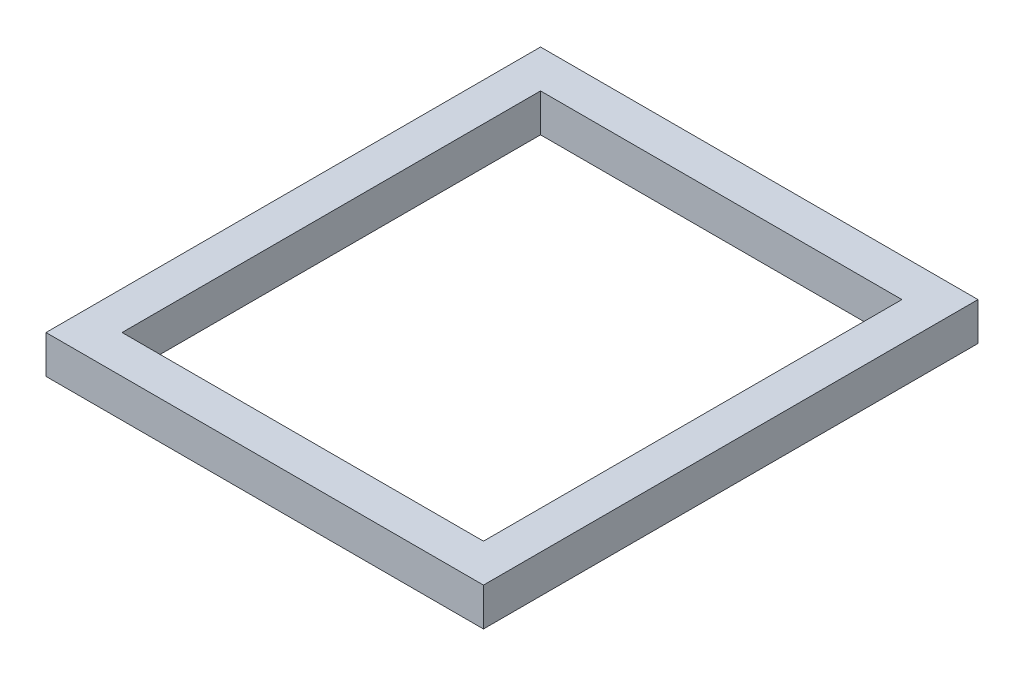
ISO-10303-21;
HEADER;
FILE_DESCRIPTION(('STEP AP214'),'2;1');
FILE_NAME('part.step','',(''),(''),'','','');
FILE_SCHEMA(('AUTOMOTIVE_DESIGN { 1 0 10303 214 1 1 1 1 }'));
ENDSEC;
DATA;
#1=APPLICATION_CONTEXT('core data for automotive mechanical design processes');
#2=APPLICATION_PROTOCOL_DEFINITION('international standard','automotive_design',2000,#1);
#3=PRODUCT_CONTEXT('',#1,'mechanical');
#4=PRODUCT('Part','Part','',(#3));
#5=PRODUCT_RELATED_PRODUCT_CATEGORY('part','',(#4));
#6=PRODUCT_DEFINITION_FORMATION('','',#4);
#7=PRODUCT_DEFINITION_CONTEXT('part definition',#1,'design');
#8=PRODUCT_DEFINITION('design','',#6,#7);
#9=PRODUCT_DEFINITION_SHAPE('','',#8);
#10=(LENGTH_UNIT() NAMED_UNIT(*) SI_UNIT(.MILLI.,.METRE.));
#11=(NAMED_UNIT(*) PLANE_ANGLE_UNIT() SI_UNIT($,.RADIAN.));
#12=(NAMED_UNIT(*) SI_UNIT($,.STERADIAN.) SOLID_ANGLE_UNIT());
#13=UNCERTAINTY_MEASURE_WITH_UNIT(LENGTH_MEASURE(1.E-05),#10,'distance_accuracy_value','');
#14=(GEOMETRIC_REPRESENTATION_CONTEXT(3) GLOBAL_UNCERTAINTY_ASSIGNED_CONTEXT((#13)) GLOBAL_UNIT_ASSIGNED_CONTEXT((#10,
#11,#12)) REPRESENTATION_CONTEXT('',''));
#15=CARTESIAN_POINT('',(0.,0.,0.));
#16=DIRECTION('',(0.,0.,1.));
#17=DIRECTION('',(1.,0.,0.));
#18=AXIS2_PLACEMENT_3D('',#15,#16,#17);
#19=CARTESIAN_POINT('',(0.,6.35,0.));
#20=DIRECTION('',(0.,-1.,0.));
#21=DIRECTION('',(0.,0.,-1.));
#22=AXIS2_PLACEMENT_3D('',#19,#20,#21);
#23=PLANE('',#22);
#24=DIRECTION('',(0.,0.,-1.));
#25=VECTOR('',#24,1.);
#26=CARTESIAN_POINT('',(36.5125,6.35,41.275));
#27=LINE('',#26,#25);
#28=CARTESIAN_POINT('',(36.5125,6.35,41.275));
#29=VERTEX_POINT('',#28);
#30=CARTESIAN_POINT('',(36.5125,6.35,-41.275));
#31=VERTEX_POINT('',#30);
#32=EDGE_CURVE('E134',#29,#31,#27,.T.);
#33=ORIENTED_EDGE('',*,*,#32,.T.);
#34=DIRECTION('',(-1.,0.,0.));
#35=VECTOR('',#34,1.);
#36=CARTESIAN_POINT('',(-36.5125,6.35,-41.275));
#37=LINE('',#36,#35);
#38=CARTESIAN_POINT('',(-36.5125,6.35,-41.275));
#39=VERTEX_POINT('',#38);
#40=EDGE_CURVE('E137',#31,#39,#37,.T.);
#41=ORIENTED_EDGE('',*,*,#40,.T.);
#42=DIRECTION('',(0.,0.,1.));
#43=VECTOR('',#42,1.);
#44=CARTESIAN_POINT('',(-36.5125,6.35,41.275));
#45=LINE('',#44,#43);
#46=CARTESIAN_POINT('',(-36.5125,6.35,41.275));
#47=VERTEX_POINT('',#46);
#48=EDGE_CURVE('E140',#39,#47,#45,.T.);
#49=ORIENTED_EDGE('',*,*,#48,.T.);
#50=DIRECTION('',(1.,0.,0.));
#51=VECTOR('',#50,1.);
#52=CARTESIAN_POINT('',(-36.5125,6.35,41.275));
#53=LINE('',#52,#51);
#54=EDGE_CURVE('E142',#47,#29,#53,.T.);
#55=ORIENTED_EDGE('',*,*,#54,.T.);
#56=EDGE_LOOP('',(#33,#41,#49,#55));
#57=FACE_BOUND('',#56,.T.);
#58=DIRECTION('',(0.,0.,-1.));
#59=VECTOR('',#58,1.);
#60=CARTESIAN_POINT('',(30.1625,6.35,34.925));
#61=LINE('',#60,#59);
#62=CARTESIAN_POINT('',(30.1625,6.35,34.925));
#63=VERTEX_POINT('',#62);
#64=CARTESIAN_POINT('',(30.1625,6.35,-34.925));
#65=VERTEX_POINT('',#64);
#66=EDGE_CURVE('E98',#63,#65,#61,.T.);
#67=ORIENTED_EDGE('',*,*,#66,.F.);
#68=DIRECTION('',(1.,0.,0.));
#69=VECTOR('',#68,1.);
#70=CARTESIAN_POINT('',(-30.1625,6.35,34.925));
#71=LINE('',#70,#69);
#72=CARTESIAN_POINT('',(-30.1625,6.35,34.925));
#73=VERTEX_POINT('',#72);
#74=EDGE_CURVE('E120',#73,#63,#71,.T.);
#75=ORIENTED_EDGE('',*,*,#74,.F.);
#76=DIRECTION('',(0.,0.,1.));
#77=VECTOR('',#76,1.);
#78=CARTESIAN_POINT('',(-30.1625,6.35,34.925));
#79=LINE('',#78,#77);
#80=CARTESIAN_POINT('',(-30.1625,6.35,-34.925));
#81=VERTEX_POINT('',#80);
#82=EDGE_CURVE('E118',#81,#73,#79,.T.);
#83=ORIENTED_EDGE('',*,*,#82,.F.);
#84=DIRECTION('',(-1.,0.,0.));
#85=VECTOR('',#84,1.);
#86=CARTESIAN_POINT('',(-30.1625,6.35,-34.925));
#87=LINE('',#86,#85);
#88=EDGE_CURVE('E106',#65,#81,#87,.T.);
#89=ORIENTED_EDGE('',*,*,#88,.F.);
#90=EDGE_LOOP('',(#67,#75,#83,#89));
#91=FACE_BOUND('',#90,.T.);
#92=ADVANCED_FACE('F33',(#57,#91),#23,.F.);
#93=CARTESIAN_POINT('',(0.,0.,0.));
#94=DIRECTION('',(0.,-1.,0.));
#95=DIRECTION('',(0.,0.,-1.));
#96=AXIS2_PLACEMENT_3D('',#93,#94,#95);
#97=PLANE('',#96);
#98=DIRECTION('',(0.,0.,-1.));
#99=VECTOR('',#98,1.);
#100=CARTESIAN_POINT('',(36.5125,0.,41.275));
#101=LINE('',#100,#99);
#102=CARTESIAN_POINT('',(36.5125,0.,41.275));
#103=VERTEX_POINT('',#102);
#104=CARTESIAN_POINT('',(36.5125,0.,-41.275));
#105=VERTEX_POINT('',#104);
#106=EDGE_CURVE('E114',#103,#105,#101,.T.);
#107=ORIENTED_EDGE('',*,*,#106,.F.);
#108=DIRECTION('',(1.,0.,0.));
#109=VECTOR('',#108,1.);
#110=CARTESIAN_POINT('',(-36.5125,0.,41.275));
#111=LINE('',#110,#109);
#112=CARTESIAN_POINT('',(-36.5125,0.,41.275));
#113=VERTEX_POINT('',#112);
#114=EDGE_CURVE('E138',#113,#103,#111,.T.);
#115=ORIENTED_EDGE('',*,*,#114,.F.);
#116=DIRECTION('',(0.,0.,1.));
#117=VECTOR('',#116,1.);
#118=CARTESIAN_POINT('',(-36.5125,0.,41.275));
#119=LINE('',#118,#117);
#120=CARTESIAN_POINT('',(-36.5125,0.,-41.275));
#121=VERTEX_POINT('',#120);
#122=EDGE_CURVE('E149',#121,#113,#119,.T.);
#123=ORIENTED_EDGE('',*,*,#122,.F.);
#124=DIRECTION('',(-1.,0.,0.));
#125=VECTOR('',#124,1.);
#126=CARTESIAN_POINT('',(-36.5125,0.,-41.275));
#127=LINE('',#126,#125);
#128=EDGE_CURVE('E147',#105,#121,#127,.T.);
#129=ORIENTED_EDGE('',*,*,#128,.F.);
#130=EDGE_LOOP('',(#107,#115,#123,#129));
#131=FACE_BOUND('',#130,.T.);
#132=DIRECTION('',(1.,0.,0.));
#133=VECTOR('',#132,1.);
#134=CARTESIAN_POINT('',(-30.1625,0.,34.925));
#135=LINE('',#134,#133);
#136=CARTESIAN_POINT('',(-30.1625,0.,34.925));
#137=VERTEX_POINT('',#136);
#138=CARTESIAN_POINT('',(30.1625,0.,34.925));
#139=VERTEX_POINT('',#138);
#140=EDGE_CURVE('E107',#137,#139,#135,.T.);
#141=ORIENTED_EDGE('',*,*,#140,.T.);
#142=DIRECTION('',(0.,0.,-1.));
#143=VECTOR('',#142,1.);
#144=CARTESIAN_POINT('',(30.1625,0.,34.925));
#145=LINE('',#144,#143);
#146=CARTESIAN_POINT('',(30.1625,0.,-34.925));
#147=VERTEX_POINT('',#146);
#148=EDGE_CURVE('E56',#139,#147,#145,.T.);
#149=ORIENTED_EDGE('',*,*,#148,.T.);
#150=DIRECTION('',(-1.,0.,0.));
#151=VECTOR('',#150,1.);
#152=CARTESIAN_POINT('',(-30.1625,0.,-34.925));
#153=LINE('',#152,#151);
#154=CARTESIAN_POINT('',(-30.1625,0.,-34.925));
#155=VERTEX_POINT('',#154);
#156=EDGE_CURVE('E113',#147,#155,#153,.T.);
#157=ORIENTED_EDGE('',*,*,#156,.T.);
#158=DIRECTION('',(0.,0.,1.));
#159=VECTOR('',#158,1.);
#160=CARTESIAN_POINT('',(-30.1625,0.,34.925));
#161=LINE('',#160,#159);
#162=EDGE_CURVE('E126',#155,#137,#161,.T.);
#163=ORIENTED_EDGE('',*,*,#162,.T.);
#164=EDGE_LOOP('',(#141,#149,#157,#163));
#165=FACE_BOUND('',#164,.T.);
#166=ADVANCED_FACE('F167',(#131,#165),#97,.T.);
#167=CARTESIAN_POINT('',(36.5125,6.35,41.275));
#168=DIRECTION('',(-1.,0.,0.));
#169=DIRECTION('',(0.,0.,1.));
#170=AXIS2_PLACEMENT_3D('',#167,#168,#169);
#171=PLANE('',#170);
#172=ORIENTED_EDGE('',*,*,#106,.T.);
#173=DIRECTION('',(0.,-1.,0.));
#174=VECTOR('',#173,1.);
#175=CARTESIAN_POINT('',(36.5125,6.35,-41.275));
#176=LINE('',#175,#174);
#177=EDGE_CURVE('E11',#31,#105,#176,.T.);
#178=ORIENTED_EDGE('',*,*,#177,.F.);
#179=ORIENTED_EDGE('',*,*,#32,.F.);
#180=DIRECTION('',(0.,-1.,0.));
#181=VECTOR('',#180,1.);
#182=CARTESIAN_POINT('',(36.5125,6.35,41.275));
#183=LINE('',#182,#181);
#184=EDGE_CURVE('E144',#29,#103,#183,.T.);
#185=ORIENTED_EDGE('',*,*,#184,.T.);
#186=EDGE_LOOP('',(#172,#178,#179,#185));
#187=FACE_BOUND('',#186,.T.);
#188=ADVANCED_FACE('F35',(#187),#171,.F.);
#189=CARTESIAN_POINT('',(-36.5125,6.35,-41.275));
#190=DIRECTION('',(0.,0.,1.));
#191=DIRECTION('',(1.,0.,0.));
#192=AXIS2_PLACEMENT_3D('',#189,#190,#191);
#193=PLANE('',#192);
#194=ORIENTED_EDGE('',*,*,#128,.T.);
#195=DIRECTION('',(0.,-1.,0.));
#196=VECTOR('',#195,1.);
#197=CARTESIAN_POINT('',(-36.5125,6.35,-41.275));
#198=LINE('',#197,#196);
#199=EDGE_CURVE('E41',#39,#121,#198,.T.);
#200=ORIENTED_EDGE('',*,*,#199,.F.);
#201=ORIENTED_EDGE('',*,*,#40,.F.);
#202=ORIENTED_EDGE('',*,*,#177,.T.);
#203=EDGE_LOOP('',(#194,#200,#201,#202));
#204=FACE_BOUND('',#203,.T.);
#205=ADVANCED_FACE('F177',(#204),#193,.F.);
#206=CARTESIAN_POINT('',(-36.5125,6.35,41.275));
#207=DIRECTION('',(1.,0.,0.));
#208=DIRECTION('',(0.,0.,-1.));
#209=AXIS2_PLACEMENT_3D('',#206,#207,#208);
#210=PLANE('',#209);
#211=ORIENTED_EDGE('',*,*,#122,.T.);
#212=DIRECTION('',(0.,-1.,0.));
#213=VECTOR('',#212,1.);
#214=CARTESIAN_POINT('',(-36.5125,6.35,41.275));
#215=LINE('',#214,#213);
#216=EDGE_CURVE('E154',#47,#113,#215,.T.);
#217=ORIENTED_EDGE('',*,*,#216,.F.);
#218=ORIENTED_EDGE('',*,*,#48,.F.);
#219=ORIENTED_EDGE('',*,*,#199,.T.);
#220=EDGE_LOOP('',(#211,#217,#218,#219));
#221=FACE_BOUND('',#220,.T.);
#222=ADVANCED_FACE('F161',(#221),#210,.F.);
#223=CARTESIAN_POINT('',(-36.5125,6.35,41.275));
#224=DIRECTION('',(0.,0.,-1.));
#225=DIRECTION('',(-1.,0.,0.));
#226=AXIS2_PLACEMENT_3D('',#223,#224,#225);
#227=PLANE('',#226);
#228=ORIENTED_EDGE('',*,*,#114,.T.);
#229=ORIENTED_EDGE('',*,*,#184,.F.);
#230=ORIENTED_EDGE('',*,*,#54,.F.);
#231=ORIENTED_EDGE('',*,*,#216,.T.);
#232=EDGE_LOOP('',(#228,#229,#230,#231));
#233=FACE_BOUND('',#232,.T.);
#234=ADVANCED_FACE('F171',(#233),#227,.F.);
#235=CARTESIAN_POINT('',(30.1625,6.35,34.925));
#236=DIRECTION('',(-1.,0.,0.));
#237=DIRECTION('',(0.,0.,1.));
#238=AXIS2_PLACEMENT_3D('',#235,#236,#237);
#239=PLANE('',#238);
#240=ORIENTED_EDGE('',*,*,#148,.F.);
#241=DIRECTION('',(0.,-1.,0.));
#242=VECTOR('',#241,1.);
#243=CARTESIAN_POINT('',(30.1625,6.35,34.925));
#244=LINE('',#243,#242);
#245=EDGE_CURVE('E102',#63,#139,#244,.T.);
#246=ORIENTED_EDGE('',*,*,#245,.F.);
#247=ORIENTED_EDGE('',*,*,#66,.T.);
#248=DIRECTION('',(0.,-1.,0.));
#249=VECTOR('',#248,1.);
#250=CARTESIAN_POINT('',(30.1625,6.35,-34.925));
#251=LINE('',#250,#249);
#252=EDGE_CURVE('E101',#65,#147,#251,.T.);
#253=ORIENTED_EDGE('',*,*,#252,.T.);
#254=EDGE_LOOP('',(#240,#246,#247,#253));
#255=FACE_BOUND('',#254,.T.);
#256=ADVANCED_FACE('F100',(#255),#239,.T.);
#257=CARTESIAN_POINT('',(-30.1625,6.35,-34.925));
#258=DIRECTION('',(0.,0.,1.));
#259=DIRECTION('',(1.,0.,0.));
#260=AXIS2_PLACEMENT_3D('',#257,#258,#259);
#261=PLANE('',#260);
#262=ORIENTED_EDGE('',*,*,#156,.F.);
#263=ORIENTED_EDGE('',*,*,#252,.F.);
#264=ORIENTED_EDGE('',*,*,#88,.T.);
#265=DIRECTION('',(0.,-1.,0.));
#266=VECTOR('',#265,1.);
#267=CARTESIAN_POINT('',(-30.1625,6.35,-34.925));
#268=LINE('',#267,#266);
#269=EDGE_CURVE('E115',#81,#155,#268,.T.);
#270=ORIENTED_EDGE('',*,*,#269,.T.);
#271=EDGE_LOOP('',(#262,#263,#264,#270));
#272=FACE_BOUND('',#271,.T.);
#273=ADVANCED_FACE('F110',(#272),#261,.T.);
#274=CARTESIAN_POINT('',(-30.1625,6.35,34.925));
#275=DIRECTION('',(1.,0.,0.));
#276=DIRECTION('',(0.,0.,-1.));
#277=AXIS2_PLACEMENT_3D('',#274,#275,#276);
#278=PLANE('',#277);
#279=ORIENTED_EDGE('',*,*,#162,.F.);
#280=ORIENTED_EDGE('',*,*,#269,.F.);
#281=ORIENTED_EDGE('',*,*,#82,.T.);
#282=DIRECTION('',(0.,-1.,0.));
#283=VECTOR('',#282,1.);
#284=CARTESIAN_POINT('',(-30.1625,6.35,34.925));
#285=LINE('',#284,#283);
#286=EDGE_CURVE('E48',#73,#137,#285,.T.);
#287=ORIENTED_EDGE('',*,*,#286,.T.);
#288=EDGE_LOOP('',(#279,#280,#281,#287));
#289=FACE_BOUND('',#288,.T.);
#290=ADVANCED_FACE('F200',(#289),#278,.T.);
#291=CARTESIAN_POINT('',(-30.1625,6.35,34.925));
#292=DIRECTION('',(0.,0.,-1.));
#293=DIRECTION('',(-1.,0.,0.));
#294=AXIS2_PLACEMENT_3D('',#291,#292,#293);
#295=PLANE('',#294);
#296=ORIENTED_EDGE('',*,*,#140,.F.);
#297=ORIENTED_EDGE('',*,*,#286,.F.);
#298=ORIENTED_EDGE('',*,*,#74,.T.);
#299=ORIENTED_EDGE('',*,*,#245,.T.);
#300=EDGE_LOOP('',(#296,#297,#298,#299));
#301=FACE_BOUND('',#300,.T.);
#302=ADVANCED_FACE('F204',(#301),#295,.T.);
#303=CLOSED_SHELL('',(#92,#166,#188,#205,#222,#234,#256,#273,#290,#302));
#304=MANIFOLD_SOLID_BREP('B2',#303);
#305=ADVANCED_BREP_SHAPE_REPRESENTATION('',(#18,#304),#14);
#306=SHAPE_DEFINITION_REPRESENTATION(#9,#305);
ENDSEC;
END-ISO-10303-21;
